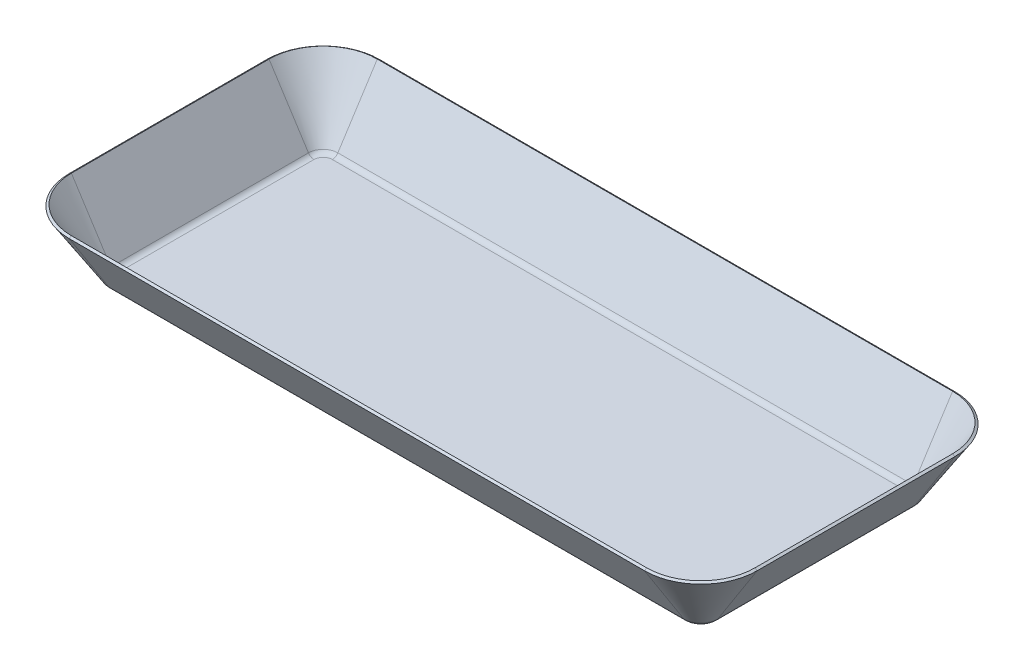
ISO-10303-21;
HEADER;
FILE_DESCRIPTION(('STEP AP214'),'2;1');
FILE_NAME('part.step','',(''),(''),'','','');
FILE_SCHEMA(('AUTOMOTIVE_DESIGN { 1 0 10303 214 1 1 1 1 }'));
ENDSEC;
DATA;
#1=APPLICATION_CONTEXT('core data for automotive mechanical design processes');
#2=APPLICATION_PROTOCOL_DEFINITION('international standard','automotive_design',2000,#1);
#3=PRODUCT_CONTEXT('',#1,'mechanical');
#4=PRODUCT('Part','Part','',(#3));
#5=PRODUCT_RELATED_PRODUCT_CATEGORY('part','',(#4));
#6=PRODUCT_DEFINITION_FORMATION('','',#4);
#7=PRODUCT_DEFINITION_CONTEXT('part definition',#1,'design');
#8=PRODUCT_DEFINITION('design','',#6,#7);
#9=PRODUCT_DEFINITION_SHAPE('','',#8);
#10=(LENGTH_UNIT() NAMED_UNIT(*) SI_UNIT(.MILLI.,.METRE.));
#11=(NAMED_UNIT(*) PLANE_ANGLE_UNIT() SI_UNIT($,.RADIAN.));
#12=(NAMED_UNIT(*) SI_UNIT($,.STERADIAN.) SOLID_ANGLE_UNIT());
#13=UNCERTAINTY_MEASURE_WITH_UNIT(LENGTH_MEASURE(1.E-05),#10,'distance_accuracy_value','');
#14=(GEOMETRIC_REPRESENTATION_CONTEXT(3) GLOBAL_UNCERTAINTY_ASSIGNED_CONTEXT((#13)) GLOBAL_UNIT_ASSIGNED_CONTEXT((#10,
#11,#12)) REPRESENTATION_CONTEXT('',''));
#15=CARTESIAN_POINT('',(0.,0.,0.));
#16=DIRECTION('',(0.,0.,1.));
#17=DIRECTION('',(1.,0.,0.));
#18=AXIS2_PLACEMENT_3D('',#15,#16,#17);
#19=CARTESIAN_POINT('',(109.654182987576,24.0502271978409,-37.6688623210117));
#20=DIRECTION('',(0.,-1.,0.));
#21=DIRECTION('',(0.,0.,-1.));
#22=AXIS2_PLACEMENT_3D('',#19,#20,#21);
#23=CONICAL_SURFACE('',#22,21.4745309195161,1.0006676821167);
#24=DIRECTION('',(-0.841831547404705,0.539740350348387,0.));
#25=VECTOR('',#24,1.);
#26=CARTESIAN_POINT('',(131.128713907092,24.0502271978409,-37.6688623210117));
#27=LINE('',#26,#25);
#28=CARTESIAN_POINT('',(131.128713907092,24.0502271978409,-37.6688623210117));
#29=VERTEX_POINT('',#28);
#30=CARTESIAN_POINT('',(130.286882359687,24.5899675481892,-37.6688623210117));
#31=VERTEX_POINT('',#30);
#32=EDGE_CURVE('E12',#29,#31,#27,.T.);
#33=ORIENTED_EDGE('',*,*,#32,.F.);
#34=CARTESIAN_POINT('',(109.654182987576,24.0502271978409,-37.6688623210117));
#35=DIRECTION('',(0.,1.,0.));
#36=DIRECTION('',(1.,0.,0.));
#37=AXIS2_PLACEMENT_3D('',#34,#35,#36);
#38=CIRCLE('',#37,21.4745309195161);
#39=CARTESIAN_POINT('',(109.654182987576,24.0502271978409,-59.1433932405278));
#40=VERTEX_POINT('',#39);
#41=EDGE_CURVE('E410',#29,#40,#38,.T.);
#42=ORIENTED_EDGE('',*,*,#41,.T.);
#43=DIRECTION('',(0.,0.539740350348387,0.841831547404705));
#44=VECTOR('',#43,1.);
#45=CARTESIAN_POINT('',(109.654182987576,24.0502271978409,-59.1433932405278));
#46=LINE('',#45,#44);
#47=CARTESIAN_POINT('',(109.654182987576,24.5899675481892,-58.3015616931231));
#48=VERTEX_POINT('',#47);
#49=EDGE_CURVE('E52',#40,#48,#46,.T.);
#50=ORIENTED_EDGE('',*,*,#49,.T.);
#51=CARTESIAN_POINT('',(109.654182987576,24.5899675481892,-37.6688623210117));
#52=DIRECTION('',(0.,1.,0.));
#53=DIRECTION('',(0.,0.,1.));
#54=AXIS2_PLACEMENT_3D('',#51,#52,#53);
#55=CIRCLE('',#54,20.6326993721114);
#56=EDGE_CURVE('E308',#31,#48,#55,.T.);
#57=ORIENTED_EDGE('',*,*,#56,.F.);
#58=EDGE_LOOP('',(#33,#42,#50,#57));
#59=FACE_BOUND('',#58,.T.);
#60=ADVANCED_FACE('F42',(#59),#23,.T.);
#61=CARTESIAN_POINT('',(109.654182987576,24.0502271978409,-59.1433932405278));
#62=DIRECTION('',(0.,0.841831547404705,-0.539740350348387));
#63=DIRECTION('',(-1.,0.,0.));
#64=AXIS2_PLACEMENT_3D('',#61,#62,#63);
#65=PLANE('',#64);
#66=ORIENTED_EDGE('',*,*,#49,.F.);
#67=DIRECTION('',(-1.,0.,0.));
#68=VECTOR('',#67,1.);
#69=CARTESIAN_POINT('',(109.654182987576,24.0502271978409,-59.1433932405278));
#70=LINE('',#69,#68);
#71=CARTESIAN_POINT('',(-109.654182987576,24.0502271978409,-59.1433932405278));
#72=VERTEX_POINT('',#71);
#73=EDGE_CURVE('E423',#40,#72,#70,.T.);
#74=ORIENTED_EDGE('',*,*,#73,.T.);
#75=DIRECTION('',(0.,0.539740350348387,0.841831547404705));
#76=VECTOR('',#75,1.);
#77=CARTESIAN_POINT('',(-109.654182987576,24.0502271978409,-59.1433932405278));
#78=LINE('',#77,#76);
#79=CARTESIAN_POINT('',(-109.654182987576,24.5899675481892,-58.3015616931231));
#80=VERTEX_POINT('',#79);
#81=EDGE_CURVE('E532',#72,#80,#78,.T.);
#82=ORIENTED_EDGE('',*,*,#81,.T.);
#83=DIRECTION('',(1.,0.,0.));
#84=VECTOR('',#83,1.);
#85=CARTESIAN_POINT('',(109.654182987576,24.5899675481892,-58.3015616931231));
#86=LINE('',#85,#84);
#87=EDGE_CURVE('E294',#48,#80,#86,.F.);
#88=ORIENTED_EDGE('',*,*,#87,.F.);
#89=EDGE_LOOP('',(#66,#74,#82,#88));
#90=FACE_BOUND('',#89,.T.);
#91=ADVANCED_FACE('F545',(#90),#65,.T.);
#92=CARTESIAN_POINT('',(-109.654182987576,24.0502271978409,-37.6688623210117));
#93=DIRECTION('',(0.,-1.,0.));
#94=DIRECTION('',(0.,0.,-1.));
#95=AXIS2_PLACEMENT_3D('',#92,#93,#94);
#96=CONICAL_SURFACE('',#95,21.4745309195161,1.0006676821167);
#97=ORIENTED_EDGE('',*,*,#81,.F.);
#98=CARTESIAN_POINT('',(-109.654182987576,24.0502271978409,-37.6688623210117));
#99=DIRECTION('',(0.,1.,0.));
#100=DIRECTION('',(0.,0.,-1.));
#101=AXIS2_PLACEMENT_3D('',#98,#99,#100);
#102=CIRCLE('',#101,21.4745309195161);
#103=CARTESIAN_POINT('',(-131.128713907092,24.0502271978409,-37.6688623210117));
#104=VERTEX_POINT('',#103);
#105=EDGE_CURVE('E436',#72,#104,#102,.T.);
#106=ORIENTED_EDGE('',*,*,#105,.T.);
#107=DIRECTION('',(0.841831547404705,0.539740350348387,0.));
#108=VECTOR('',#107,1.);
#109=CARTESIAN_POINT('',(-131.128713907092,24.0502271978409,-37.6688623210117));
#110=LINE('',#109,#108);
#111=CARTESIAN_POINT('',(-130.286882359687,24.5899675481892,-37.6688623210117));
#112=VERTEX_POINT('',#111);
#113=EDGE_CURVE('E529',#104,#112,#110,.T.);
#114=ORIENTED_EDGE('',*,*,#113,.T.);
#115=CARTESIAN_POINT('',(-109.654182987576,24.5899675481892,-37.6688623210117));
#116=DIRECTION('',(0.,1.,0.));
#117=DIRECTION('',(0.,0.,1.));
#118=AXIS2_PLACEMENT_3D('',#115,#116,#117);
#119=CIRCLE('',#118,20.6326993721114);
#120=EDGE_CURVE('E281',#80,#112,#119,.T.);
#121=ORIENTED_EDGE('',*,*,#120,.F.);
#122=EDGE_LOOP('',(#97,#106,#114,#121));
#123=FACE_BOUND('',#122,.T.);
#124=ADVANCED_FACE('F625',(#123),#96,.T.);
#125=CARTESIAN_POINT('',(-131.128713907092,24.0502271978409,-37.6688623210117));
#126=DIRECTION('',(-0.539740350348387,0.841831547404705,0.));
#127=DIRECTION('',(0.,0.,1.));
#128=AXIS2_PLACEMENT_3D('',#125,#126,#127);
#129=PLANE('',#128);
#130=ORIENTED_EDGE('',*,*,#113,.F.);
#131=DIRECTION('',(0.,0.,1.));
#132=VECTOR('',#131,1.);
#133=CARTESIAN_POINT('',(-131.128713907092,24.0502271978409,-37.6688623210117));
#134=LINE('',#133,#132);
#135=CARTESIAN_POINT('',(-131.128713907092,24.0502271978409,37.6688623210117));
#136=VERTEX_POINT('',#135);
#137=EDGE_CURVE('E449',#104,#136,#134,.T.);
#138=ORIENTED_EDGE('',*,*,#137,.T.);
#139=DIRECTION('',(0.841831547404705,0.539740350348387,0.));
#140=VECTOR('',#139,1.);
#141=CARTESIAN_POINT('',(-131.128713907092,24.0502271978409,37.6688623210117));
#142=LINE('',#141,#140);
#143=CARTESIAN_POINT('',(-130.286882359687,24.5899675481892,37.6688623210117));
#144=VERTEX_POINT('',#143);
#145=EDGE_CURVE('E526',#136,#144,#142,.T.);
#146=ORIENTED_EDGE('',*,*,#145,.T.);
#147=DIRECTION('',(0.,0.,1.));
#148=VECTOR('',#147,1.);
#149=CARTESIAN_POINT('',(-130.286882359687,24.5899675481892,-37.6688623210117));
#150=LINE('',#149,#148);
#151=EDGE_CURVE('E267',#112,#144,#150,.T.);
#152=ORIENTED_EDGE('',*,*,#151,.F.);
#153=EDGE_LOOP('',(#130,#138,#146,#152));
#154=FACE_BOUND('',#153,.T.);
#155=ADVANCED_FACE('F974',(#154),#129,.T.);
#156=CARTESIAN_POINT('',(-109.654182987576,24.0502271978409,37.6688623210117));
#157=DIRECTION('',(0.,-1.,0.));
#158=DIRECTION('',(0.,0.,-1.));
#159=AXIS2_PLACEMENT_3D('',#156,#157,#158);
#160=CONICAL_SURFACE('',#159,21.4745309195161,1.0006676821167);
#161=ORIENTED_EDGE('',*,*,#145,.F.);
#162=CARTESIAN_POINT('',(-109.654182987576,24.0502271978409,37.6688623210117));
#163=DIRECTION('',(0.,1.,0.));
#164=DIRECTION('',(-1.,0.,0.));
#165=AXIS2_PLACEMENT_3D('',#162,#163,#164);
#166=CIRCLE('',#165,21.4745309195161);
#167=CARTESIAN_POINT('',(-109.654182987576,24.0502271978409,59.1433932405278));
#168=VERTEX_POINT('',#167);
#169=EDGE_CURVE('E462',#136,#168,#166,.T.);
#170=ORIENTED_EDGE('',*,*,#169,.T.);
#171=DIRECTION('',(0.,0.539740350348387,-0.841831547404705));
#172=VECTOR('',#171,1.);
#173=CARTESIAN_POINT('',(-109.654182987576,24.0502271978409,59.1433932405278));
#174=LINE('',#173,#172);
#175=CARTESIAN_POINT('',(-109.654182987576,24.5899675481892,58.3015616931231));
#176=VERTEX_POINT('',#175);
#177=EDGE_CURVE('E523',#168,#176,#174,.T.);
#178=ORIENTED_EDGE('',*,*,#177,.T.);
#179=CARTESIAN_POINT('',(-109.654182987576,24.5899675481892,37.6688623210117));
#180=DIRECTION('',(0.,1.,0.));
#181=DIRECTION('',(0.,0.,1.));
#182=AXIS2_PLACEMENT_3D('',#179,#180,#181);
#183=CIRCLE('',#182,20.6326993721114);
#184=EDGE_CURVE('E246',#144,#176,#183,.T.);
#185=ORIENTED_EDGE('',*,*,#184,.F.);
#186=EDGE_LOOP('',(#161,#170,#178,#185));
#187=FACE_BOUND('',#186,.T.);
#188=ADVANCED_FACE('F573',(#187),#160,.T.);
#189=CARTESIAN_POINT('',(-109.654182987576,24.0502271978409,59.1433932405278));
#190=DIRECTION('',(0.,0.841831547404705,0.539740350348387));
#191=DIRECTION('',(1.,0.,0.));
#192=AXIS2_PLACEMENT_3D('',#189,#190,#191);
#193=PLANE('',#192);
#194=ORIENTED_EDGE('',*,*,#177,.F.);
#195=DIRECTION('',(1.,0.,0.));
#196=VECTOR('',#195,1.);
#197=CARTESIAN_POINT('',(-109.654182987576,24.0502271978409,59.1433932405278));
#198=LINE('',#197,#196);
#199=CARTESIAN_POINT('',(109.654182987576,24.0502271978409,59.1433932405278));
#200=VERTEX_POINT('',#199);
#201=EDGE_CURVE('E471',#168,#200,#198,.T.);
#202=ORIENTED_EDGE('',*,*,#201,.T.);
#203=DIRECTION('',(0.,0.539740350348387,-0.841831547404705));
#204=VECTOR('',#203,1.);
#205=CARTESIAN_POINT('',(109.654182987576,24.0502271978409,59.1433932405278));
#206=LINE('',#205,#204);
#207=CARTESIAN_POINT('',(109.654182987576,24.5899675481892,58.3015616931231));
#208=VERTEX_POINT('',#207);
#209=EDGE_CURVE('E520',#200,#208,#206,.T.);
#210=ORIENTED_EDGE('',*,*,#209,.T.);
#211=DIRECTION('',(1.,0.,0.));
#212=VECTOR('',#211,1.);
#213=CARTESIAN_POINT('',(-109.654182987576,24.5899675481892,58.3015616931231));
#214=LINE('',#213,#212);
#215=EDGE_CURVE('E227',#176,#208,#214,.T.);
#216=ORIENTED_EDGE('',*,*,#215,.F.);
#217=EDGE_LOOP('',(#194,#202,#210,#216));
#218=FACE_BOUND('',#217,.T.);
#219=ADVANCED_FACE('F575',(#218),#193,.T.);
#220=CARTESIAN_POINT('',(109.654182987576,24.0502271978409,37.6688623210117));
#221=DIRECTION('',(0.,-1.,0.));
#222=DIRECTION('',(0.,0.,-1.));
#223=AXIS2_PLACEMENT_3D('',#220,#221,#222);
#224=CONICAL_SURFACE('',#223,21.4745309195161,1.0006676821167);
#225=ORIENTED_EDGE('',*,*,#209,.F.);
#226=CARTESIAN_POINT('',(109.654182987576,24.0502271978409,37.6688623210117));
#227=DIRECTION('',(0.,1.,0.));
#228=DIRECTION('',(0.,0.,1.));
#229=AXIS2_PLACEMENT_3D('',#226,#227,#228);
#230=CIRCLE('',#229,21.4745309195161);
#231=CARTESIAN_POINT('',(131.128713907092,24.0502271978409,37.6688623210117));
#232=VERTEX_POINT('',#231);
#233=EDGE_CURVE('E252',#200,#232,#230,.T.);
#234=ORIENTED_EDGE('',*,*,#233,.T.);
#235=DIRECTION('',(-0.841831547404705,0.539740350348387,0.));
#236=VECTOR('',#235,1.);
#237=CARTESIAN_POINT('',(131.128713907092,24.0502271978409,37.6688623210117));
#238=LINE('',#237,#236);
#239=CARTESIAN_POINT('',(130.286882359687,24.5899675481892,37.6688623210117));
#240=VERTEX_POINT('',#239);
#241=EDGE_CURVE('E46',#232,#240,#238,.T.);
#242=ORIENTED_EDGE('',*,*,#241,.T.);
#243=CARTESIAN_POINT('',(109.654182987576,24.5899675481892,37.6688623210117));
#244=DIRECTION('',(0.,1.,0.));
#245=DIRECTION('',(0.,0.,1.));
#246=AXIS2_PLACEMENT_3D('',#243,#244,#245);
#247=CIRCLE('',#246,20.6326993721114);
#248=EDGE_CURVE('E216',#208,#240,#247,.T.);
#249=ORIENTED_EDGE('',*,*,#248,.F.);
#250=EDGE_LOOP('',(#225,#234,#242,#249));
#251=FACE_BOUND('',#250,.T.);
#252=ADVANCED_FACE('F579',(#251),#224,.T.);
#253=CARTESIAN_POINT('',(131.128713907092,24.0502271978409,37.6688623210117));
#254=DIRECTION('',(0.539740350348387,0.841831547404705,0.));
#255=DIRECTION('',(0.,0.,-1.));
#256=AXIS2_PLACEMENT_3D('',#253,#254,#255);
#257=PLANE('',#256);
#258=DIRECTION('',(0.,0.,-1.));
#259=VECTOR('',#258,1.);
#260=CARTESIAN_POINT('',(131.128713907092,24.0502271978409,37.6688623210117));
#261=LINE('',#260,#259);
#262=EDGE_CURVE('E397',#232,#29,#261,.T.);
#263=ORIENTED_EDGE('',*,*,#262,.T.);
#264=ORIENTED_EDGE('',*,*,#32,.T.);
#265=DIRECTION('',(0.,0.,1.));
#266=VECTOR('',#265,1.);
#267=CARTESIAN_POINT('',(130.286882359687,24.5899675481892,37.6688623210117));
#268=LINE('',#267,#266);
#269=EDGE_CURVE('E322',#240,#31,#268,.F.);
#270=ORIENTED_EDGE('',*,*,#269,.F.);
#271=ORIENTED_EDGE('',*,*,#241,.F.);
#272=EDGE_LOOP('',(#263,#264,#270,#271));
#273=FACE_BOUND('',#272,.T.);
#274=ADVANCED_FACE('F599',(#273),#257,.T.);
#275=CARTESIAN_POINT('',(109.654182987576,1.15064912412903,37.6688623210117));
#276=DIRECTION('',(0.,1.,0.));
#277=DIRECTION('',(0.,0.,1.));
#278=AXIS2_PLACEMENT_3D('',#275,#276,#277);
#279=CONICAL_SURFACE('',#278,5.60457886851177,0.570128644678198);
#280=CARTESIAN_POINT('',(109.654182987576,1.15064912412903,37.6688623210117));
#281=DIRECTION('',(0.,1.,0.));
#282=DIRECTION('',(0.,0.,1.));
#283=AXIS2_PLACEMENT_3D('',#280,#281,#282);
#284=CIRCLE('',#283,5.60457886851177);
#285=CARTESIAN_POINT('',(109.654182987576,1.15064912412903,43.2734411895234));
#286=VERTEX_POINT('',#285);
#287=CARTESIAN_POINT('',(115.258761856088,1.15064912412903,37.6688623210117));
#288=VERTEX_POINT('',#287);
#289=EDGE_CURVE('E203',#286,#288,#284,.T.);
#290=ORIENTED_EDGE('',*,*,#289,.F.);
#291=DIRECTION('',(0.,0.841831547404705,0.539740350348387));
#292=VECTOR('',#291,1.);
#293=CARTESIAN_POINT('',(109.654182987576,1.15064912412903,43.2734411895234));
#294=LINE('',#293,#292);
#295=EDGE_CURVE('E207',#286,#208,#294,.T.);
#296=ORIENTED_EDGE('',*,*,#295,.T.);
#297=ORIENTED_EDGE('',*,*,#248,.T.);
#298=DIRECTION('',(-0.539740350348387,-0.841831547404705,0.));
#299=VECTOR('',#298,1.);
#300=CARTESIAN_POINT('',(114.225927592962,-0.460259649651613,37.6688623210117));
#301=LINE('',#300,#299);
#302=EDGE_CURVE('E209',#288,#240,#301,.F.);
#303=ORIENTED_EDGE('',*,*,#302,.F.);
#304=EDGE_LOOP('',(#290,#296,#297,#303));
#305=FACE_BOUND('',#304,.T.);
#306=ADVANCED_FACE('F205',(#305),#279,.F.);
#307=CARTESIAN_POINT('',(109.654182987576,2.5,37.6688623210117));
#308=DIRECTION('',(0.,1.,0.));
#309=DIRECTION('',(0.,0.,1.));
#310=AXIS2_PLACEMENT_3D('',#307,#308,#309);
#311=TOROIDAL_SURFACE('',#310,3.50000000000001,2.5);
#312=CARTESIAN_POINT('',(109.654182987576,0.,37.6688623210117));
#313=DIRECTION('',(0.,1.,0.));
#314=DIRECTION('',(0.,0.,1.));
#315=AXIS2_PLACEMENT_3D('',#312,#313,#314);
#316=CIRCLE('',#315,3.50000000000001);
#317=CARTESIAN_POINT('',(109.654182987576,0.,41.1688623210117));
#318=VERTEX_POINT('',#317);
#319=CARTESIAN_POINT('',(113.154182987576,0.,37.6688623210117));
#320=VERTEX_POINT('',#319);
#321=EDGE_CURVE('E217',#318,#320,#316,.T.);
#322=ORIENTED_EDGE('',*,*,#321,.F.);
#323=CARTESIAN_POINT('',(109.654182987576,2.5,41.1688623210117));
#324=DIRECTION('',(-1.,0.,0.));
#325=DIRECTION('',(0.,0.,1.));
#326=AXIS2_PLACEMENT_3D('',#323,#324,#325);
#327=CIRCLE('',#326,2.5);
#328=EDGE_CURVE('E235',#318,#286,#327,.T.);
#329=ORIENTED_EDGE('',*,*,#328,.T.);
#330=ORIENTED_EDGE('',*,*,#289,.T.);
#331=CARTESIAN_POINT('',(113.154182987576,2.5,37.6688623210117));
#332=DIRECTION('',(0.,0.,-1.));
#333=DIRECTION('',(-1.,0.,0.));
#334=AXIS2_PLACEMENT_3D('',#331,#332,#333);
#335=CIRCLE('',#334,2.5);
#336=EDGE_CURVE('E250',#320,#288,#335,.F.);
#337=ORIENTED_EDGE('',*,*,#336,.F.);
#338=EDGE_LOOP('',(#322,#329,#330,#337));
#339=FACE_BOUND('',#338,.T.);
#340=ADVANCED_FACE('F241',(#339),#311,.F.);
#341=CARTESIAN_POINT('',(-109.654182987576,-0.460259649651613,42.2406069263978));
#342=DIRECTION('',(0.,0.539740350348387,-0.841831547404705));
#343=DIRECTION('',(0.,0.841831547404705,0.539740350348387));
#344=AXIS2_PLACEMENT_3D('',#341,#342,#343);
#345=PLANE('',#344);
#346=ORIENTED_EDGE('',*,*,#215,.T.);
#347=ORIENTED_EDGE('',*,*,#295,.F.);
#348=DIRECTION('',(1.,0.,0.));
#349=VECTOR('',#348,1.);
#350=CARTESIAN_POINT('',(-109.654182987576,1.15064912412903,43.2734411895235));
#351=LINE('',#350,#349);
#352=CARTESIAN_POINT('',(-109.654182987576,1.15064912412903,43.2734411895234));
#353=VERTEX_POINT('',#352);
#354=EDGE_CURVE('E224',#353,#286,#351,.T.);
#355=ORIENTED_EDGE('',*,*,#354,.F.);
#356=DIRECTION('',(0.,0.841831547404705,0.539740350348387));
#357=VECTOR('',#356,1.);
#358=CARTESIAN_POINT('',(-109.654182987576,-0.460259649651613,42.2406069263978));
#359=LINE('',#358,#357);
#360=EDGE_CURVE('E254',#353,#176,#359,.T.);
#361=ORIENTED_EDGE('',*,*,#360,.T.);
#362=EDGE_LOOP('',(#346,#347,#355,#361));
#363=FACE_BOUND('',#362,.T.);
#364=ADVANCED_FACE('F222',(#363),#345,.T.);
#365=CARTESIAN_POINT('',(-109.654182987576,2.5,41.1688623210117));
#366=DIRECTION('',(1.,0.,0.));
#367=DIRECTION('',(0.,0.,-1.));
#368=AXIS2_PLACEMENT_3D('',#365,#366,#367);
#369=CYLINDRICAL_SURFACE('',#368,2.5);
#370=ORIENTED_EDGE('',*,*,#354,.T.);
#371=ORIENTED_EDGE('',*,*,#328,.F.);
#372=DIRECTION('',(1.,0.,0.));
#373=VECTOR('',#372,1.);
#374=CARTESIAN_POINT('',(-109.654182987576,0.,41.1688623210117));
#375=LINE('',#374,#373);
#376=CARTESIAN_POINT('',(-109.654182987576,0.,41.1688623210117));
#377=VERTEX_POINT('',#376);
#378=EDGE_CURVE('E243',#377,#318,#375,.T.);
#379=ORIENTED_EDGE('',*,*,#378,.F.);
#380=CARTESIAN_POINT('',(-109.654182987576,2.5,41.1688623210117));
#381=DIRECTION('',(1.,0.,0.));
#382=DIRECTION('',(0.,0.,-1.));
#383=AXIS2_PLACEMENT_3D('',#380,#381,#382);
#384=CIRCLE('',#383,2.5);
#385=EDGE_CURVE('E237',#377,#353,#384,.F.);
#386=ORIENTED_EDGE('',*,*,#385,.T.);
#387=EDGE_LOOP('',(#370,#371,#379,#386));
#388=FACE_BOUND('',#387,.T.);
#389=ADVANCED_FACE('F234',(#388),#369,.F.);
#390=CARTESIAN_POINT('',(-109.654182987576,1.15064912412903,37.6688623210117));
#391=DIRECTION('',(0.,1.,0.));
#392=DIRECTION('',(0.,0.,1.));
#393=AXIS2_PLACEMENT_3D('',#390,#391,#392);
#394=CONICAL_SURFACE('',#393,5.60457886851176,0.570128644678198);
#395=ORIENTED_EDGE('',*,*,#184,.T.);
#396=ORIENTED_EDGE('',*,*,#360,.F.);
#397=CARTESIAN_POINT('',(-109.654182987576,1.15064912412903,37.6688623210117));
#398=DIRECTION('',(0.,1.,0.));
#399=DIRECTION('',(0.,0.,1.));
#400=AXIS2_PLACEMENT_3D('',#397,#398,#399);
#401=CIRCLE('',#400,5.60457886851177);
#402=CARTESIAN_POINT('',(-115.258761856088,1.15064912412904,37.6688623210117));
#403=VERTEX_POINT('',#402);
#404=EDGE_CURVE('E257',#403,#353,#401,.T.);
#405=ORIENTED_EDGE('',*,*,#404,.F.);
#406=DIRECTION('',(-0.539740350348387,0.841831547404705,0.));
#407=VECTOR('',#406,1.);
#408=CARTESIAN_POINT('',(-115.258761856088,1.15064912412903,37.6688623210117));
#409=LINE('',#408,#407);
#410=EDGE_CURVE('E263',#403,#144,#409,.T.);
#411=ORIENTED_EDGE('',*,*,#410,.T.);
#412=EDGE_LOOP('',(#395,#396,#405,#411));
#413=FACE_BOUND('',#412,.T.);
#414=ADVANCED_FACE('F565',(#413),#394,.F.);
#415=CARTESIAN_POINT('',(-109.654182987576,2.5,37.6688623210117));
#416=DIRECTION('',(0.,1.,0.));
#417=DIRECTION('',(0.,0.,1.));
#418=AXIS2_PLACEMENT_3D('',#415,#416,#417);
#419=TOROIDAL_SURFACE('',#418,3.5,2.5);
#420=ORIENTED_EDGE('',*,*,#404,.T.);
#421=ORIENTED_EDGE('',*,*,#385,.F.);
#422=CARTESIAN_POINT('',(-109.654182987576,0.,37.6688623210117));
#423=DIRECTION('',(0.,1.,0.));
#424=DIRECTION('',(0.,0.,1.));
#425=AXIS2_PLACEMENT_3D('',#422,#423,#424);
#426=CIRCLE('',#425,3.50000000000001);
#427=CARTESIAN_POINT('',(-113.154182987576,0.,37.6688623210117));
#428=VERTEX_POINT('',#427);
#429=EDGE_CURVE('E59',#428,#377,#426,.T.);
#430=ORIENTED_EDGE('',*,*,#429,.F.);
#431=CARTESIAN_POINT('',(-113.154182987576,2.5,37.6688623210117));
#432=DIRECTION('',(0.,0.,-1.));
#433=DIRECTION('',(-1.,0.,0.));
#434=AXIS2_PLACEMENT_3D('',#431,#432,#433);
#435=CIRCLE('',#434,2.5);
#436=EDGE_CURVE('E269',#428,#403,#435,.T.);
#437=ORIENTED_EDGE('',*,*,#436,.T.);
#438=EDGE_LOOP('',(#420,#421,#430,#437));
#439=FACE_BOUND('',#438,.T.);
#440=ADVANCED_FACE('F562',(#439),#419,.F.);
#441=CARTESIAN_POINT('',(-114.225927592962,-0.460259649651613,-37.6688623210117));
#442=DIRECTION('',(0.841831547404705,0.539740350348387,0.));
#443=DIRECTION('',(-0.539740350348387,0.841831547404705,0.));
#444=AXIS2_PLACEMENT_3D('',#441,#442,#443);
#445=PLANE('',#444);
#446=ORIENTED_EDGE('',*,*,#151,.T.);
#447=ORIENTED_EDGE('',*,*,#410,.F.);
#448=DIRECTION('',(0.,0.,1.));
#449=VECTOR('',#448,1.);
#450=CARTESIAN_POINT('',(-115.258761856088,1.15064912412903,-37.6688623210117));
#451=LINE('',#450,#449);
#452=CARTESIAN_POINT('',(-115.258761856088,1.15064912412904,-37.6688623210117));
#453=VERTEX_POINT('',#452);
#454=EDGE_CURVE('E268',#453,#403,#451,.T.);
#455=ORIENTED_EDGE('',*,*,#454,.F.);
#456=DIRECTION('',(-0.539740350348387,0.841831547404705,0.));
#457=VECTOR('',#456,1.);
#458=CARTESIAN_POINT('',(-114.225927592962,-0.460259649651613,-37.6688623210117));
#459=LINE('',#458,#457);
#460=EDGE_CURVE('E277',#453,#112,#459,.T.);
#461=ORIENTED_EDGE('',*,*,#460,.T.);
#462=EDGE_LOOP('',(#446,#447,#455,#461));
#463=FACE_BOUND('',#462,.T.);
#464=ADVANCED_FACE('F567',(#463),#445,.T.);
#465=CARTESIAN_POINT('',(-113.154182987576,2.5,-37.6688623210117));
#466=DIRECTION('',(0.,0.,1.));
#467=DIRECTION('',(1.,0.,0.));
#468=AXIS2_PLACEMENT_3D('',#465,#466,#467);
#469=CYLINDRICAL_SURFACE('',#468,2.5);
#470=ORIENTED_EDGE('',*,*,#454,.T.);
#471=ORIENTED_EDGE('',*,*,#436,.F.);
#472=DIRECTION('',(0.,0.,1.));
#473=VECTOR('',#472,1.);
#474=CARTESIAN_POINT('',(-113.154182987576,0.,-37.6688623210117));
#475=LINE('',#474,#473);
#476=CARTESIAN_POINT('',(-113.154182987576,0.,-37.6688623210117));
#477=VERTEX_POINT('',#476);
#478=EDGE_CURVE('E273',#477,#428,#475,.T.);
#479=ORIENTED_EDGE('',*,*,#478,.F.);
#480=CARTESIAN_POINT('',(-113.154182987576,2.5,-37.6688623210117));
#481=DIRECTION('',(0.,0.,1.));
#482=DIRECTION('',(1.,0.,0.));
#483=AXIS2_PLACEMENT_3D('',#480,#481,#482);
#484=CIRCLE('',#483,2.5);
#485=EDGE_CURVE('E283',#477,#453,#484,.F.);
#486=ORIENTED_EDGE('',*,*,#485,.T.);
#487=EDGE_LOOP('',(#470,#471,#479,#486));
#488=FACE_BOUND('',#487,.T.);
#489=ADVANCED_FACE('F559',(#488),#469,.F.);
#490=CARTESIAN_POINT('',(-109.654182987576,1.15064912412903,-37.6688623210117));
#491=DIRECTION('',(0.,1.,0.));
#492=DIRECTION('',(0.,0.,1.));
#493=AXIS2_PLACEMENT_3D('',#490,#491,#492);
#494=CONICAL_SURFACE('',#493,5.60457886851177,0.570128644678198);
#495=ORIENTED_EDGE('',*,*,#120,.T.);
#496=ORIENTED_EDGE('',*,*,#460,.F.);
#497=CARTESIAN_POINT('',(-109.654182987576,1.15064912412903,-37.6688623210117));
#498=DIRECTION('',(0.,1.,0.));
#499=DIRECTION('',(0.,0.,1.));
#500=AXIS2_PLACEMENT_3D('',#497,#498,#499);
#501=CIRCLE('',#500,5.60457886851177);
#502=CARTESIAN_POINT('',(-109.654182987576,1.15064912412903,-43.2734411895234));
#503=VERTEX_POINT('',#502);
#504=EDGE_CURVE('E282',#503,#453,#501,.T.);
#505=ORIENTED_EDGE('',*,*,#504,.F.);
#506=DIRECTION('',(0.,0.841831547404705,-0.539740350348387));
#507=VECTOR('',#506,1.);
#508=CARTESIAN_POINT('',(-109.654182987576,1.15064912412903,-43.2734411895234));
#509=LINE('',#508,#507);
#510=EDGE_CURVE('E290',#503,#80,#509,.T.);
#511=ORIENTED_EDGE('',*,*,#510,.T.);
#512=EDGE_LOOP('',(#495,#496,#505,#511));
#513=FACE_BOUND('',#512,.T.);
#514=ADVANCED_FACE('F660',(#513),#494,.F.);
#515=CARTESIAN_POINT('',(-109.654182987576,2.5,-37.6688623210117));
#516=DIRECTION('',(0.,1.,0.));
#517=DIRECTION('',(0.,0.,1.));
#518=AXIS2_PLACEMENT_3D('',#515,#516,#517);
#519=TOROIDAL_SURFACE('',#518,3.50000000000001,2.5);
#520=ORIENTED_EDGE('',*,*,#504,.T.);
#521=ORIENTED_EDGE('',*,*,#485,.F.);
#522=CARTESIAN_POINT('',(-109.654182987576,0.,-37.6688623210117));
#523=DIRECTION('',(0.,1.,0.));
#524=DIRECTION('',(0.,0.,1.));
#525=AXIS2_PLACEMENT_3D('',#522,#523,#524);
#526=CIRCLE('',#525,3.50000000000001);
#527=CARTESIAN_POINT('',(-109.654182987576,0.,-41.1688623210117));
#528=VERTEX_POINT('',#527);
#529=EDGE_CURVE('E65',#528,#477,#526,.T.);
#530=ORIENTED_EDGE('',*,*,#529,.F.);
#531=CARTESIAN_POINT('',(-109.654182987576,2.5,-41.1688623210117));
#532=DIRECTION('',(1.,0.,0.));
#533=DIRECTION('',(0.,0.,-1.));
#534=AXIS2_PLACEMENT_3D('',#531,#532,#533);
#535=CIRCLE('',#534,2.5);
#536=EDGE_CURVE('E296',#528,#503,#535,.T.);
#537=ORIENTED_EDGE('',*,*,#536,.T.);
#538=EDGE_LOOP('',(#520,#521,#530,#537));
#539=FACE_BOUND('',#538,.T.);
#540=ADVANCED_FACE('F556',(#539),#519,.F.);
#541=CARTESIAN_POINT('',(109.654182987576,-0.460259649651613,-42.2406069263978));
#542=DIRECTION('',(0.,0.539740350348387,0.841831547404705));
#543=DIRECTION('',(0.,-0.841831547404705,0.539740350348387));
#544=AXIS2_PLACEMENT_3D('',#541,#542,#543);
#545=PLANE('',#544);
#546=ORIENTED_EDGE('',*,*,#87,.T.);
#547=ORIENTED_EDGE('',*,*,#510,.F.);
#548=DIRECTION('',(-1.,0.,0.));
#549=VECTOR('',#548,1.);
#550=CARTESIAN_POINT('',(109.654182987576,1.15064912412903,-43.2734411895235));
#551=LINE('',#550,#549);
#552=CARTESIAN_POINT('',(109.654182987576,1.15064912412903,-43.2734411895234));
#553=VERTEX_POINT('',#552);
#554=EDGE_CURVE('E295',#553,#503,#551,.T.);
#555=ORIENTED_EDGE('',*,*,#554,.F.);
#556=DIRECTION('',(0.,-0.841831547404705,0.539740350348387));
#557=VECTOR('',#556,1.);
#558=CARTESIAN_POINT('',(109.654182987576,-0.460259649651613,-42.2406069263978));
#559=LINE('',#558,#557);
#560=EDGE_CURVE('E304',#553,#48,#559,.F.);
#561=ORIENTED_EDGE('',*,*,#560,.T.);
#562=EDGE_LOOP('',(#546,#547,#555,#561));
#563=FACE_BOUND('',#562,.T.);
#564=ADVANCED_FACE('F549',(#563),#545,.T.);
#565=CARTESIAN_POINT('',(109.654182987576,2.5,-41.1688623210117));
#566=DIRECTION('',(-1.,0.,0.));
#567=DIRECTION('',(0.,0.,1.));
#568=AXIS2_PLACEMENT_3D('',#565,#566,#567);
#569=CYLINDRICAL_SURFACE('',#568,2.5);
#570=ORIENTED_EDGE('',*,*,#554,.T.);
#571=ORIENTED_EDGE('',*,*,#536,.F.);
#572=DIRECTION('',(-1.,0.,0.));
#573=VECTOR('',#572,1.);
#574=CARTESIAN_POINT('',(109.654182987576,0.,-41.1688623210117));
#575=LINE('',#574,#573);
#576=CARTESIAN_POINT('',(109.654182987576,0.,-41.1688623210117));
#577=VERTEX_POINT('',#576);
#578=EDGE_CURVE('E300',#577,#528,#575,.T.);
#579=ORIENTED_EDGE('',*,*,#578,.F.);
#580=CARTESIAN_POINT('',(109.654182987576,2.5,-41.1688623210117));
#581=DIRECTION('',(-1.,0.,0.));
#582=DIRECTION('',(0.,0.,1.));
#583=AXIS2_PLACEMENT_3D('',#580,#581,#582);
#584=CIRCLE('',#583,2.5);
#585=EDGE_CURVE('E310',#577,#553,#584,.F.);
#586=ORIENTED_EDGE('',*,*,#585,.T.);
#587=EDGE_LOOP('',(#570,#571,#579,#586));
#588=FACE_BOUND('',#587,.T.);
#589=ADVANCED_FACE('F552',(#588),#569,.F.);
#590=CARTESIAN_POINT('',(109.654182987576,1.15064912412903,-37.6688623210117));
#591=DIRECTION('',(0.,1.,0.));
#592=DIRECTION('',(0.,0.,1.));
#593=AXIS2_PLACEMENT_3D('',#590,#591,#592);
#594=CONICAL_SURFACE('',#593,5.60457886851176,0.570128644678198);
#595=ORIENTED_EDGE('',*,*,#56,.T.);
#596=ORIENTED_EDGE('',*,*,#560,.F.);
#597=CARTESIAN_POINT('',(109.654182987576,1.15064912412903,-37.6688623210117));
#598=DIRECTION('',(0.,1.,0.));
#599=DIRECTION('',(0.,0.,1.));
#600=AXIS2_PLACEMENT_3D('',#597,#598,#599);
#601=CIRCLE('',#600,5.60457886851177);
#602=CARTESIAN_POINT('',(115.258761856088,1.15064912412904,-37.6688623210117));
#603=VERTEX_POINT('',#602);
#604=EDGE_CURVE('E309',#603,#553,#601,.T.);
#605=ORIENTED_EDGE('',*,*,#604,.F.);
#606=DIRECTION('',(0.539740350348387,0.841831547404705,0.));
#607=VECTOR('',#606,1.);
#608=CARTESIAN_POINT('',(115.258761856088,1.15064912412903,-37.6688623210117));
#609=LINE('',#608,#607);
#610=EDGE_CURVE('E318',#603,#31,#609,.T.);
#611=ORIENTED_EDGE('',*,*,#610,.T.);
#612=EDGE_LOOP('',(#595,#596,#605,#611));
#613=FACE_BOUND('',#612,.T.);
#614=ADVANCED_FACE('F543',(#613),#594,.F.);
#615=CARTESIAN_POINT('',(109.654182987576,2.5,-37.6688623210117));
#616=DIRECTION('',(0.,1.,0.));
#617=DIRECTION('',(0.,0.,1.));
#618=AXIS2_PLACEMENT_3D('',#615,#616,#617);
#619=TOROIDAL_SURFACE('',#618,3.5,2.5);
#620=ORIENTED_EDGE('',*,*,#604,.T.);
#621=ORIENTED_EDGE('',*,*,#585,.F.);
#622=CARTESIAN_POINT('',(109.654182987576,0.,-37.6688623210117));
#623=DIRECTION('',(0.,1.,0.));
#624=DIRECTION('',(0.,0.,1.));
#625=AXIS2_PLACEMENT_3D('',#622,#623,#624);
#626=CIRCLE('',#625,3.50000000000001);
#627=CARTESIAN_POINT('',(113.154182987576,0.,-37.6688623210117));
#628=VERTEX_POINT('',#627);
#629=EDGE_CURVE('E314',#628,#577,#626,.T.);
#630=ORIENTED_EDGE('',*,*,#629,.F.);
#631=CARTESIAN_POINT('',(113.154182987576,2.5,-37.6688623210117));
#632=DIRECTION('',(0.,0.,1.));
#633=DIRECTION('',(1.,0.,0.));
#634=AXIS2_PLACEMENT_3D('',#631,#632,#633);
#635=CIRCLE('',#634,2.5);
#636=EDGE_CURVE('E324',#628,#603,#635,.T.);
#637=ORIENTED_EDGE('',*,*,#636,.T.);
#638=EDGE_LOOP('',(#620,#621,#630,#637));
#639=FACE_BOUND('',#638,.T.);
#640=ADVANCED_FACE('F611',(#639),#619,.F.);
#641=CARTESIAN_POINT('',(114.225927592962,-0.460259649651613,37.6688623210117));
#642=DIRECTION('',(-0.841831547404705,0.539740350348387,0.));
#643=DIRECTION('',(-0.539740350348387,-0.841831547404705,0.));
#644=AXIS2_PLACEMENT_3D('',#641,#642,#643);
#645=PLANE('',#644);
#646=ORIENTED_EDGE('',*,*,#269,.T.);
#647=ORIENTED_EDGE('',*,*,#610,.F.);
#648=DIRECTION('',(0.,0.,-1.));
#649=VECTOR('',#648,1.);
#650=CARTESIAN_POINT('',(115.258761856088,1.15064912412903,37.6688623210117));
#651=LINE('',#650,#649);
#652=EDGE_CURVE('E323',#288,#603,#651,.T.);
#653=ORIENTED_EDGE('',*,*,#652,.F.);
#654=ORIENTED_EDGE('',*,*,#302,.T.);
#655=EDGE_LOOP('',(#646,#647,#653,#654));
#656=FACE_BOUND('',#655,.T.);
#657=ADVANCED_FACE('F603',(#656),#645,.T.);
#658=CARTESIAN_POINT('',(113.154182987576,2.5,37.6688623210117));
#659=DIRECTION('',(0.,0.,-1.));
#660=DIRECTION('',(-1.,0.,0.));
#661=AXIS2_PLACEMENT_3D('',#658,#659,#660);
#662=CYLINDRICAL_SURFACE('',#661,2.5);
#663=ORIENTED_EDGE('',*,*,#652,.T.);
#664=ORIENTED_EDGE('',*,*,#636,.F.);
#665=DIRECTION('',(0.,0.,-1.));
#666=VECTOR('',#665,1.);
#667=CARTESIAN_POINT('',(113.154182987576,0.,37.6688623210117));
#668=LINE('',#667,#666);
#669=EDGE_CURVE('E328',#320,#628,#668,.T.);
#670=ORIENTED_EDGE('',*,*,#669,.F.);
#671=ORIENTED_EDGE('',*,*,#336,.T.);
#672=EDGE_LOOP('',(#663,#664,#670,#671));
#673=FACE_BOUND('',#672,.T.);
#674=ADVANCED_FACE('F607',(#673),#662,.F.);
#675=CARTESIAN_POINT('',(109.654182987576,0.610908773780648,37.6688623210117));
#676=DIRECTION('',(0.,1.,0.));
#677=DIRECTION('',(0.,0.,1.));
#678=AXIS2_PLACEMENT_3D('',#675,#676,#677);
#679=CONICAL_SURFACE('',#678,6.44641041591647,0.570128644678198);
#680=CARTESIAN_POINT('',(109.654182987576,0.610908773780647,37.6688623210117));
#681=DIRECTION('',(0.,1.,0.));
#682=DIRECTION('',(0.,0.,1.));
#683=AXIS2_PLACEMENT_3D('',#680,#681,#682);
#684=CIRCLE('',#683,6.44641041591647);
#685=CARTESIAN_POINT('',(109.654182987576,0.610908773780647,44.1152727369282));
#686=VERTEX_POINT('',#685);
#687=CARTESIAN_POINT('',(116.100593403492,0.610908773780647,37.6688623210117));
#688=VERTEX_POINT('',#687);
#689=EDGE_CURVE('E463',#686,#688,#684,.T.);
#690=ORIENTED_EDGE('',*,*,#689,.T.);
#691=DIRECTION('',(0.539740350348387,0.841831547404705,0.));
#692=VECTOR('',#691,1.);
#693=CARTESIAN_POINT('',(115.067759140367,-1.,37.6688623210117));
#694=LINE('',#693,#692);
#695=EDGE_CURVE('E372',#688,#232,#694,.T.);
#696=ORIENTED_EDGE('',*,*,#695,.T.);
#697=ORIENTED_EDGE('',*,*,#233,.F.);
#698=DIRECTION('',(0.,0.841831547404705,0.539740350348387));
#699=VECTOR('',#698,1.);
#700=CARTESIAN_POINT('',(109.654182987576,-1.,43.0824384738025));
#701=LINE('',#700,#699);
#702=EDGE_CURVE('E458',#686,#200,#701,.T.);
#703=ORIENTED_EDGE('',*,*,#702,.F.);
#704=EDGE_LOOP('',(#690,#696,#697,#703));
#705=FACE_BOUND('',#704,.T.);
#706=ADVANCED_FACE('F587',(#705),#679,.T.);
#707=CARTESIAN_POINT('',(109.654182987576,2.5,37.6688623210117));
#708=DIRECTION('',(0.,1.,0.));
#709=DIRECTION('',(0.,0.,1.));
#710=AXIS2_PLACEMENT_3D('',#707,#708,#709);
#711=TOROIDAL_SURFACE('',#710,3.50000000000001,3.5);
#712=CARTESIAN_POINT('',(109.654182987576,-1.,37.6688623210117));
#713=DIRECTION('',(0.,1.,0.));
#714=DIRECTION('',(0.,0.,1.));
#715=AXIS2_PLACEMENT_3D('',#712,#713,#714);
#716=CIRCLE('',#715,3.50000000000001);
#717=CARTESIAN_POINT('',(109.654182987576,-1.,41.1688623210117));
#718=VERTEX_POINT('',#717);
#719=CARTESIAN_POINT('',(113.154182987576,-1.,37.6688623210117));
#720=VERTEX_POINT('',#719);
#721=EDGE_CURVE('E467',#718,#720,#716,.T.);
#722=ORIENTED_EDGE('',*,*,#721,.T.);
#723=CARTESIAN_POINT('',(113.154182987576,2.5,37.6688623210117));
#724=DIRECTION('',(0.,0.,-1.));
#725=DIRECTION('',(-1.,0.,0.));
#726=AXIS2_PLACEMENT_3D('',#723,#724,#725);
#727=CIRCLE('',#726,3.5);
#728=EDGE_CURVE('E368',#720,#688,#727,.F.);
#729=ORIENTED_EDGE('',*,*,#728,.T.);
#730=ORIENTED_EDGE('',*,*,#689,.F.);
#731=CARTESIAN_POINT('',(109.654182987576,2.5,41.1688623210117));
#732=DIRECTION('',(1.,0.,0.));
#733=DIRECTION('',(0.,0.,-1.));
#734=AXIS2_PLACEMENT_3D('',#731,#732,#733);
#735=CIRCLE('',#734,3.5);
#736=EDGE_CURVE('E450',#718,#686,#735,.F.);
#737=ORIENTED_EDGE('',*,*,#736,.F.);
#738=EDGE_LOOP('',(#722,#729,#730,#737));
#739=FACE_BOUND('',#738,.T.);
#740=ADVANCED_FACE('F590',(#739),#711,.T.);
#741=CARTESIAN_POINT('',(-109.654182987576,-1.,43.0824384738025));
#742=DIRECTION('',(0.,0.539740350348387,-0.841831547404705));
#743=DIRECTION('',(0.,0.841831547404705,0.539740350348387));
#744=AXIS2_PLACEMENT_3D('',#741,#742,#743);
#745=PLANE('',#744);
#746=ORIENTED_EDGE('',*,*,#201,.F.);
#747=DIRECTION('',(0.,0.841831547404705,0.539740350348387));
#748=VECTOR('',#747,1.);
#749=CARTESIAN_POINT('',(-109.654182987576,-1.,43.0824384738025));
#750=LINE('',#749,#748);
#751=CARTESIAN_POINT('',(-109.654182987576,0.610908773780647,44.1152727369281));
#752=VERTEX_POINT('',#751);
#753=EDGE_CURVE('E445',#752,#168,#750,.T.);
#754=ORIENTED_EDGE('',*,*,#753,.F.);
#755=DIRECTION('',(1.,0.,0.));
#756=VECTOR('',#755,1.);
#757=CARTESIAN_POINT('',(-109.654182987576,0.610908773780647,44.1152727369282));
#758=LINE('',#757,#756);
#759=EDGE_CURVE('E454',#752,#686,#758,.T.);
#760=ORIENTED_EDGE('',*,*,#759,.T.);
#761=ORIENTED_EDGE('',*,*,#702,.T.);
#762=EDGE_LOOP('',(#746,#754,#760,#761));
#763=FACE_BOUND('',#762,.T.);
#764=ADVANCED_FACE('F582',(#763),#745,.F.);
#765=CARTESIAN_POINT('',(-109.654182987576,2.5,41.1688623210117));
#766=DIRECTION('',(1.,0.,0.));
#767=DIRECTION('',(0.,0.,-1.));
#768=AXIS2_PLACEMENT_3D('',#765,#766,#767);
#769=CYLINDRICAL_SURFACE('',#768,3.5);
#770=ORIENTED_EDGE('',*,*,#759,.F.);
#771=CARTESIAN_POINT('',(-109.654182987576,2.5,41.1688623210117));
#772=DIRECTION('',(1.,0.,0.));
#773=DIRECTION('',(0.,0.,-1.));
#774=AXIS2_PLACEMENT_3D('',#771,#772,#773);
#775=CIRCLE('',#774,3.5);
#776=CARTESIAN_POINT('',(-109.654182987576,-1.,41.1688623210117));
#777=VERTEX_POINT('',#776);
#778=EDGE_CURVE('E437',#777,#752,#775,.F.);
#779=ORIENTED_EDGE('',*,*,#778,.F.);
#780=DIRECTION('',(1.,0.,0.));
#781=VECTOR('',#780,1.);
#782=CARTESIAN_POINT('',(-109.654182987576,-1.,41.1688623210117));
#783=LINE('',#782,#781);
#784=EDGE_CURVE('E455',#777,#718,#783,.T.);
#785=ORIENTED_EDGE('',*,*,#784,.T.);
#786=ORIENTED_EDGE('',*,*,#736,.T.);
#787=EDGE_LOOP('',(#770,#779,#785,#786));
#788=FACE_BOUND('',#787,.T.);
#789=ADVANCED_FACE('F732',(#788),#769,.T.);
#790=CARTESIAN_POINT('',(-109.654182987576,0.610908773780648,37.6688623210117));
#791=DIRECTION('',(0.,1.,0.));
#792=DIRECTION('',(0.,0.,1.));
#793=AXIS2_PLACEMENT_3D('',#790,#791,#792);
#794=CONICAL_SURFACE('',#793,6.44641041591647,0.570128644678198);
#795=ORIENTED_EDGE('',*,*,#169,.F.);
#796=DIRECTION('',(-0.539740350348387,0.841831547404705,0.));
#797=VECTOR('',#796,1.);
#798=CARTESIAN_POINT('',(-115.067759140367,-1.,37.6688623210117));
#799=LINE('',#798,#797);
#800=CARTESIAN_POINT('',(-116.100593403492,0.610908773780647,37.6688623210117));
#801=VERTEX_POINT('',#800);
#802=EDGE_CURVE('E432',#801,#136,#799,.T.);
#803=ORIENTED_EDGE('',*,*,#802,.F.);
#804=CARTESIAN_POINT('',(-109.654182987576,0.610908773780647,37.6688623210117));
#805=DIRECTION('',(0.,1.,0.));
#806=DIRECTION('',(-1.,0.,0.));
#807=AXIS2_PLACEMENT_3D('',#804,#805,#806);
#808=CIRCLE('',#807,6.44641041591647);
#809=EDGE_CURVE('E441',#801,#752,#808,.T.);
#810=ORIENTED_EDGE('',*,*,#809,.T.);
#811=ORIENTED_EDGE('',*,*,#753,.T.);
#812=EDGE_LOOP('',(#795,#803,#810,#811));
#813=FACE_BOUND('',#812,.T.);
#814=ADVANCED_FACE('F742',(#813),#794,.T.);
#815=CARTESIAN_POINT('',(-109.654182987576,2.5,37.6688623210117));
#816=DIRECTION('',(0.,1.,0.));
#817=DIRECTION('',(0.,0.,1.));
#818=AXIS2_PLACEMENT_3D('',#815,#816,#817);
#819=TOROIDAL_SURFACE('',#818,3.5,3.5);
#820=ORIENTED_EDGE('',*,*,#809,.F.);
#821=CARTESIAN_POINT('',(-113.154182987576,2.5,37.6688623210117));
#822=DIRECTION('',(0.,0.,1.));
#823=DIRECTION('',(1.,0.,0.));
#824=AXIS2_PLACEMENT_3D('',#821,#822,#823);
#825=CIRCLE('',#824,3.5);
#826=CARTESIAN_POINT('',(-113.154182987576,-1.,37.6688623210117));
#827=VERTEX_POINT('',#826);
#828=EDGE_CURVE('E424',#827,#801,#825,.F.);
#829=ORIENTED_EDGE('',*,*,#828,.F.);
#830=CARTESIAN_POINT('',(-109.654182987576,-1.,37.6688623210117));
#831=DIRECTION('',(0.,1.,0.));
#832=DIRECTION('',(-1.,0.,0.));
#833=AXIS2_PLACEMENT_3D('',#830,#831,#832);
#834=CIRCLE('',#833,3.5);
#835=EDGE_CURVE('E442',#827,#777,#834,.T.);
#836=ORIENTED_EDGE('',*,*,#835,.T.);
#837=ORIENTED_EDGE('',*,*,#778,.T.);
#838=EDGE_LOOP('',(#820,#829,#836,#837));
#839=FACE_BOUND('',#838,.T.);
#840=ADVANCED_FACE('F753',(#839),#819,.T.);
#841=CARTESIAN_POINT('',(-115.067759140367,-1.,-37.6688623210117));
#842=DIRECTION('',(0.841831547404705,0.539740350348387,0.));
#843=DIRECTION('',(-0.539740350348387,0.841831547404705,0.));
#844=AXIS2_PLACEMENT_3D('',#841,#842,#843);
#845=PLANE('',#844);
#846=ORIENTED_EDGE('',*,*,#137,.F.);
#847=DIRECTION('',(-0.539740350348387,0.841831547404705,0.));
#848=VECTOR('',#847,1.);
#849=CARTESIAN_POINT('',(-115.067759140367,-1.,-37.6688623210117));
#850=LINE('',#849,#848);
#851=CARTESIAN_POINT('',(-116.100593403492,0.610908773780647,-37.6688623210117));
#852=VERTEX_POINT('',#851);
#853=EDGE_CURVE('E419',#852,#104,#850,.T.);
#854=ORIENTED_EDGE('',*,*,#853,.F.);
#855=DIRECTION('',(0.,0.,1.));
#856=VECTOR('',#855,1.);
#857=CARTESIAN_POINT('',(-116.100593403492,0.610908773780647,-37.6688623210117));
#858=LINE('',#857,#856);
#859=EDGE_CURVE('E428',#852,#801,#858,.T.);
#860=ORIENTED_EDGE('',*,*,#859,.T.);
#861=ORIENTED_EDGE('',*,*,#802,.T.);
#862=EDGE_LOOP('',(#846,#854,#860,#861));
#863=FACE_BOUND('',#862,.T.);
#864=ADVANCED_FACE('F764',(#863),#845,.F.);
#865=CARTESIAN_POINT('',(-113.154182987576,2.5,-37.6688623210117));
#866=DIRECTION('',(0.,0.,1.));
#867=DIRECTION('',(1.,0.,0.));
#868=AXIS2_PLACEMENT_3D('',#865,#866,#867);
#869=CYLINDRICAL_SURFACE('',#868,3.5);
#870=ORIENTED_EDGE('',*,*,#859,.F.);
#871=CARTESIAN_POINT('',(-113.154182987576,2.5,-37.6688623210117));
#872=DIRECTION('',(0.,0.,1.));
#873=DIRECTION('',(1.,0.,0.));
#874=AXIS2_PLACEMENT_3D('',#871,#872,#873);
#875=CIRCLE('',#874,3.5);
#876=CARTESIAN_POINT('',(-113.154182987576,-1.,-37.6688623210117));
#877=VERTEX_POINT('',#876);
#878=EDGE_CURVE('E411',#877,#852,#875,.F.);
#879=ORIENTED_EDGE('',*,*,#878,.F.);
#880=DIRECTION('',(0.,0.,1.));
#881=VECTOR('',#880,1.);
#882=CARTESIAN_POINT('',(-113.154182987576,-1.,-37.6688623210117));
#883=LINE('',#882,#881);
#884=EDGE_CURVE('E429',#877,#827,#883,.T.);
#885=ORIENTED_EDGE('',*,*,#884,.T.);
#886=ORIENTED_EDGE('',*,*,#828,.T.);
#887=EDGE_LOOP('',(#870,#879,#885,#886));
#888=FACE_BOUND('',#887,.T.);
#889=ADVANCED_FACE('F775',(#888),#869,.T.);
#890=CARTESIAN_POINT('',(-109.654182987576,0.610908773780648,-37.6688623210117));
#891=DIRECTION('',(0.,1.,0.));
#892=DIRECTION('',(0.,0.,1.));
#893=AXIS2_PLACEMENT_3D('',#890,#891,#892);
#894=CONICAL_SURFACE('',#893,6.44641041591647,0.570128644678198);
#895=ORIENTED_EDGE('',*,*,#105,.F.);
#896=DIRECTION('',(0.,0.841831547404705,-0.539740350348387));
#897=VECTOR('',#896,1.);
#898=CARTESIAN_POINT('',(-109.654182987576,-1.,-43.0824384738025));
#899=LINE('',#898,#897);
#900=CARTESIAN_POINT('',(-109.654182987576,0.610908773780647,-44.1152727369282));
#901=VERTEX_POINT('',#900);
#902=EDGE_CURVE('E406',#901,#72,#899,.T.);
#903=ORIENTED_EDGE('',*,*,#902,.F.);
#904=CARTESIAN_POINT('',(-109.654182987576,0.610908773780647,-37.6688623210117));
#905=DIRECTION('',(0.,1.,0.));
#906=DIRECTION('',(0.,0.,-1.));
#907=AXIS2_PLACEMENT_3D('',#904,#905,#906);
#908=CIRCLE('',#907,6.44641041591647);
#909=EDGE_CURVE('E415',#901,#852,#908,.T.);
#910=ORIENTED_EDGE('',*,*,#909,.T.);
#911=ORIENTED_EDGE('',*,*,#853,.T.);
#912=EDGE_LOOP('',(#895,#903,#910,#911));
#913=FACE_BOUND('',#912,.T.);
#914=ADVANCED_FACE('F655',(#913),#894,.T.);
#915=CARTESIAN_POINT('',(-109.654182987576,2.5,-37.6688623210117));
#916=DIRECTION('',(0.,1.,0.));
#917=DIRECTION('',(0.,0.,1.));
#918=AXIS2_PLACEMENT_3D('',#915,#916,#917);
#919=TOROIDAL_SURFACE('',#918,3.50000000000001,3.5);
#920=ORIENTED_EDGE('',*,*,#909,.F.);
#921=CARTESIAN_POINT('',(-109.654182987576,2.5,-41.1688623210117));
#922=DIRECTION('',(-1.,0.,0.));
#923=DIRECTION('',(0.,0.,1.));
#924=AXIS2_PLACEMENT_3D('',#921,#922,#923);
#925=CIRCLE('',#924,3.5);
#926=CARTESIAN_POINT('',(-109.654182987576,-1.,-41.1688623210117));
#927=VERTEX_POINT('',#926);
#928=EDGE_CURVE('E398',#927,#901,#925,.F.);
#929=ORIENTED_EDGE('',*,*,#928,.F.);
#930=CARTESIAN_POINT('',(-109.654182987576,-1.,-37.6688623210117));
#931=DIRECTION('',(0.,1.,0.));
#932=DIRECTION('',(0.,0.,-1.));
#933=AXIS2_PLACEMENT_3D('',#930,#931,#932);
#934=CIRCLE('',#933,3.50000000000001);
#935=EDGE_CURVE('E416',#927,#877,#934,.T.);
#936=ORIENTED_EDGE('',*,*,#935,.T.);
#937=ORIENTED_EDGE('',*,*,#878,.T.);
#938=EDGE_LOOP('',(#920,#929,#936,#937));
#939=FACE_BOUND('',#938,.T.);
#940=ADVANCED_FACE('F796',(#939),#919,.T.);
#941=CARTESIAN_POINT('',(109.654182987576,-1.,-43.0824384738025));
#942=DIRECTION('',(0.,0.539740350348387,0.841831547404705));
#943=DIRECTION('',(0.,-0.841831547404705,0.539740350348387));
#944=AXIS2_PLACEMENT_3D('',#941,#942,#943);
#945=PLANE('',#944);
#946=ORIENTED_EDGE('',*,*,#73,.F.);
#947=DIRECTION('',(0.,0.841831547404705,-0.539740350348387));
#948=VECTOR('',#947,1.);
#949=CARTESIAN_POINT('',(109.654182987576,-1.,-43.0824384738025));
#950=LINE('',#949,#948);
#951=CARTESIAN_POINT('',(109.654182987576,0.610908773780647,-44.1152727369281));
#952=VERTEX_POINT('',#951);
#953=EDGE_CURVE('E393',#952,#40,#950,.T.);
#954=ORIENTED_EDGE('',*,*,#953,.F.);
#955=DIRECTION('',(-1.,0.,0.));
#956=VECTOR('',#955,1.);
#957=CARTESIAN_POINT('',(109.654182987576,0.610908773780647,-44.1152727369282));
#958=LINE('',#957,#956);
#959=EDGE_CURVE('E402',#952,#901,#958,.T.);
#960=ORIENTED_EDGE('',*,*,#959,.T.);
#961=ORIENTED_EDGE('',*,*,#902,.T.);
#962=EDGE_LOOP('',(#946,#954,#960,#961));
#963=FACE_BOUND('',#962,.T.);
#964=ADVANCED_FACE('F651',(#963),#945,.F.);
#965=CARTESIAN_POINT('',(109.654182987576,2.5,-41.1688623210117));
#966=DIRECTION('',(-1.,0.,0.));
#967=DIRECTION('',(0.,0.,1.));
#968=AXIS2_PLACEMENT_3D('',#965,#966,#967);
#969=CYLINDRICAL_SURFACE('',#968,3.5);
#970=ORIENTED_EDGE('',*,*,#959,.F.);
#971=CARTESIAN_POINT('',(109.654182987576,2.5,-41.1688623210117));
#972=DIRECTION('',(-1.,0.,0.));
#973=DIRECTION('',(0.,0.,1.));
#974=AXIS2_PLACEMENT_3D('',#971,#972,#973);
#975=CIRCLE('',#974,3.5);
#976=CARTESIAN_POINT('',(109.654182987576,-1.,-41.1688623210117));
#977=VERTEX_POINT('',#976);
#978=EDGE_CURVE('E385',#977,#952,#975,.F.);
#979=ORIENTED_EDGE('',*,*,#978,.F.);
#980=DIRECTION('',(-1.,0.,0.));
#981=VECTOR('',#980,1.);
#982=CARTESIAN_POINT('',(109.654182987576,-1.,-41.1688623210117));
#983=LINE('',#982,#981);
#984=EDGE_CURVE('E403',#977,#927,#983,.T.);
#985=ORIENTED_EDGE('',*,*,#984,.T.);
#986=ORIENTED_EDGE('',*,*,#928,.T.);
#987=EDGE_LOOP('',(#970,#979,#985,#986));
#988=FACE_BOUND('',#987,.T.);
#989=ADVANCED_FACE('F816',(#988),#969,.T.);
#990=CARTESIAN_POINT('',(109.654182987576,0.610908773780648,-37.6688623210117));
#991=DIRECTION('',(0.,1.,0.));
#992=DIRECTION('',(0.,0.,1.));
#993=AXIS2_PLACEMENT_3D('',#990,#991,#992);
#994=CONICAL_SURFACE('',#993,6.44641041591647,0.570128644678198);
#995=ORIENTED_EDGE('',*,*,#41,.F.);
#996=DIRECTION('',(0.539740350348387,0.841831547404705,0.));
#997=VECTOR('',#996,1.);
#998=CARTESIAN_POINT('',(115.067759140367,-1.,-37.6688623210117));
#999=LINE('',#998,#997);
#1000=CARTESIAN_POINT('',(116.100593403492,0.610908773780647,-37.6688623210117));
#1001=VERTEX_POINT('',#1000);
#1002=EDGE_CURVE('E381',#1001,#29,#999,.T.);
#1003=ORIENTED_EDGE('',*,*,#1002,.F.);
#1004=CARTESIAN_POINT('',(109.654182987576,0.610908773780647,-37.6688623210117));
#1005=DIRECTION('',(0.,1.,0.));
#1006=DIRECTION('',(1.,0.,0.));
#1007=AXIS2_PLACEMENT_3D('',#1004,#1005,#1006);
#1008=CIRCLE('',#1007,6.44641041591647);
#1009=EDGE_CURVE('E389',#1001,#952,#1008,.T.);
#1010=ORIENTED_EDGE('',*,*,#1009,.T.);
#1011=ORIENTED_EDGE('',*,*,#953,.T.);
#1012=EDGE_LOOP('',(#995,#1003,#1010,#1011));
#1013=FACE_BOUND('',#1012,.T.);
#1014=ADVANCED_FACE('F647',(#1013),#994,.T.);
#1015=CARTESIAN_POINT('',(109.654182987576,2.5,-37.6688623210117));
#1016=DIRECTION('',(0.,1.,0.));
#1017=DIRECTION('',(0.,0.,1.));
#1018=AXIS2_PLACEMENT_3D('',#1015,#1016,#1017);
#1019=TOROIDAL_SURFACE('',#1018,3.5,3.5);
#1020=ORIENTED_EDGE('',*,*,#1009,.F.);
#1021=CARTESIAN_POINT('',(113.154182987576,2.5,-37.6688623210117));
#1022=DIRECTION('',(0.,0.,-1.));
#1023=DIRECTION('',(-1.,0.,0.));
#1024=AXIS2_PLACEMENT_3D('',#1021,#1022,#1023);
#1025=CIRCLE('',#1024,3.5);
#1026=CARTESIAN_POINT('',(113.154182987576,-1.,-37.6688623210117));
#1027=VERTEX_POINT('',#1026);
#1028=EDGE_CURVE('E373',#1027,#1001,#1025,.F.);
#1029=ORIENTED_EDGE('',*,*,#1028,.F.);
#1030=CARTESIAN_POINT('',(109.654182987576,-1.,-37.6688623210117));
#1031=DIRECTION('',(0.,1.,0.));
#1032=DIRECTION('',(1.,0.,0.));
#1033=AXIS2_PLACEMENT_3D('',#1030,#1031,#1032);
#1034=CIRCLE('',#1033,3.5);
#1035=EDGE_CURVE('E390',#1027,#977,#1034,.T.);
#1036=ORIENTED_EDGE('',*,*,#1035,.T.);
#1037=ORIENTED_EDGE('',*,*,#978,.T.);
#1038=EDGE_LOOP('',(#1020,#1029,#1036,#1037));
#1039=FACE_BOUND('',#1038,.T.);
#1040=ADVANCED_FACE('F643',(#1039),#1019,.T.);
#1041=CARTESIAN_POINT('',(115.067759140367,-1.,37.6688623210117));
#1042=DIRECTION('',(-0.841831547404705,0.539740350348387,0.));
#1043=DIRECTION('',(-0.539740350348387,-0.841831547404705,0.));
#1044=AXIS2_PLACEMENT_3D('',#1041,#1042,#1043);
#1045=PLANE('',#1044);
#1046=ORIENTED_EDGE('',*,*,#262,.F.);
#1047=ORIENTED_EDGE('',*,*,#695,.F.);
#1048=DIRECTION('',(0.,0.,-1.));
#1049=VECTOR('',#1048,1.);
#1050=CARTESIAN_POINT('',(116.100593403492,0.610908773780647,37.6688623210117));
#1051=LINE('',#1050,#1049);
#1052=EDGE_CURVE('E377',#688,#1001,#1051,.T.);
#1053=ORIENTED_EDGE('',*,*,#1052,.T.);
#1054=ORIENTED_EDGE('',*,*,#1002,.T.);
#1055=EDGE_LOOP('',(#1046,#1047,#1053,#1054));
#1056=FACE_BOUND('',#1055,.T.);
#1057=ADVANCED_FACE('F596',(#1056),#1045,.F.);
#1058=CARTESIAN_POINT('',(113.154182987576,2.5,37.6688623210117));
#1059=DIRECTION('',(0.,0.,-1.));
#1060=DIRECTION('',(-1.,0.,0.));
#1061=AXIS2_PLACEMENT_3D('',#1058,#1059,#1060);
#1062=CYLINDRICAL_SURFACE('',#1061,3.5);
#1063=ORIENTED_EDGE('',*,*,#1052,.F.);
#1064=ORIENTED_EDGE('',*,*,#728,.F.);
#1065=DIRECTION('',(0.,0.,-1.));
#1066=VECTOR('',#1065,1.);
#1067=CARTESIAN_POINT('',(113.154182987576,-1.,37.6688623210117));
#1068=LINE('',#1067,#1066);
#1069=EDGE_CURVE('E378',#720,#1027,#1068,.T.);
#1070=ORIENTED_EDGE('',*,*,#1069,.T.);
#1071=ORIENTED_EDGE('',*,*,#1028,.T.);
#1072=EDGE_LOOP('',(#1063,#1064,#1070,#1071));
#1073=FACE_BOUND('',#1072,.T.);
#1074=ADVANCED_FACE('F632',(#1073),#1062,.T.);
#1075=CARTESIAN_POINT('',(0.,-1.,0.));
#1076=DIRECTION('',(0.,1.,0.));
#1077=DIRECTION('',(0.,0.,1.));
#1078=AXIS2_PLACEMENT_3D('',#1075,#1076,#1077);
#1079=PLANE('',#1078);
#1080=ORIENTED_EDGE('',*,*,#721,.F.);
#1081=ORIENTED_EDGE('',*,*,#784,.F.);
#1082=ORIENTED_EDGE('',*,*,#835,.F.);
#1083=ORIENTED_EDGE('',*,*,#884,.F.);
#1084=ORIENTED_EDGE('',*,*,#935,.F.);
#1085=ORIENTED_EDGE('',*,*,#984,.F.);
#1086=ORIENTED_EDGE('',*,*,#1035,.F.);
#1087=ORIENTED_EDGE('',*,*,#1069,.F.);
#1088=EDGE_LOOP('',(#1080,#1081,#1082,#1083,#1084,#1085,#1086,#1087));
#1089=FACE_BOUND('',#1088,.T.);
#1090=ADVANCED_FACE('F630',(#1089),#1079,.F.);
#1091=CARTESIAN_POINT('',(0.,0.,0.));
#1092=DIRECTION('',(0.,1.,0.));
#1093=DIRECTION('',(0.,0.,1.));
#1094=AXIS2_PLACEMENT_3D('',#1091,#1092,#1093);
#1095=PLANE('',#1094);
#1096=ORIENTED_EDGE('',*,*,#378,.T.);
#1097=ORIENTED_EDGE('',*,*,#321,.T.);
#1098=ORIENTED_EDGE('',*,*,#669,.T.);
#1099=ORIENTED_EDGE('',*,*,#629,.T.);
#1100=ORIENTED_EDGE('',*,*,#578,.T.);
#1101=ORIENTED_EDGE('',*,*,#529,.T.);
#1102=ORIENTED_EDGE('',*,*,#478,.T.);
#1103=ORIENTED_EDGE('',*,*,#429,.T.);
#1104=EDGE_LOOP('',(#1096,#1097,#1098,#1099,#1100,#1101,#1102,#1103));
#1105=FACE_BOUND('',#1104,.T.);
#1106=ADVANCED_FACE('F44',(#1105),#1095,.T.);
#1107=CLOSED_SHELL('',(#60,#91,#124,#155,#188,#219,#252,#274,#306,#340,#364,#389,#414,#440,#464,
#489,#514,#540,#564,#589,#614,#640,#657,#674,#706,#740,#764,#789,#814,#840,#864,#889,#914,#940,
#964,#989,#1014,#1040,#1057,#1074,#1090,#1106));
#1108=MANIFOLD_SOLID_BREP('B2',#1107);
#1109=ADVANCED_BREP_SHAPE_REPRESENTATION('',(#18,#1108),#14);
#1110=SHAPE_DEFINITION_REPRESENTATION(#9,#1109);
ENDSEC;
END-ISO-10303-21;
